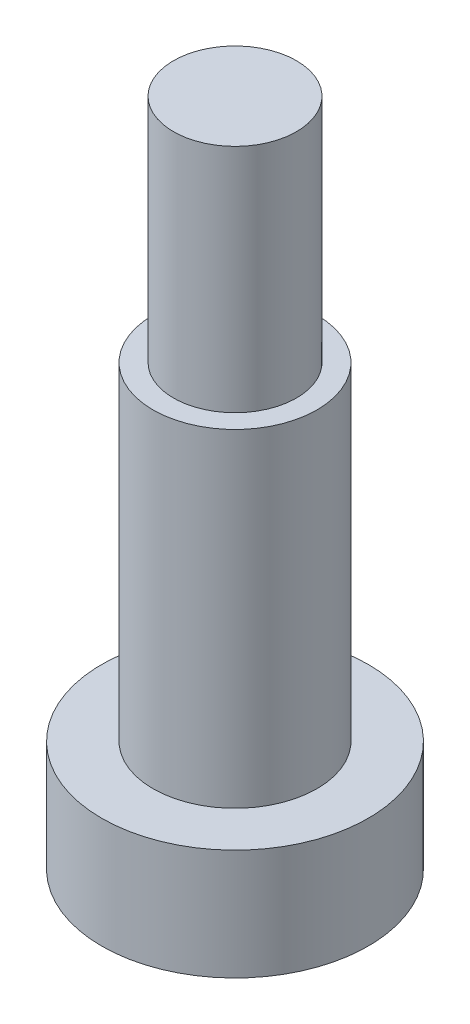
ISO-10303-21;
HEADER;
FILE_DESCRIPTION(('STEP AP214'),'2;1');
FILE_NAME('part.step','',(''),(''),'','','');
FILE_SCHEMA(('AUTOMOTIVE_DESIGN { 1 0 10303 214 1 1 1 1 }'));
ENDSEC;
DATA;
#1=APPLICATION_CONTEXT('core data for automotive mechanical design processes');
#2=APPLICATION_PROTOCOL_DEFINITION('international standard','automotive_design',2000,#1);
#3=PRODUCT_CONTEXT('',#1,'mechanical');
#4=PRODUCT('Part','Part','',(#3));
#5=PRODUCT_RELATED_PRODUCT_CATEGORY('part','',(#4));
#6=PRODUCT_DEFINITION_FORMATION('','',#4);
#7=PRODUCT_DEFINITION_CONTEXT('part definition',#1,'design');
#8=PRODUCT_DEFINITION('design','',#6,#7);
#9=PRODUCT_DEFINITION_SHAPE('','',#8);
#10=(LENGTH_UNIT() NAMED_UNIT(*) SI_UNIT(.MILLI.,.METRE.));
#11=(NAMED_UNIT(*) PLANE_ANGLE_UNIT() SI_UNIT($,.RADIAN.));
#12=(NAMED_UNIT(*) SI_UNIT($,.STERADIAN.) SOLID_ANGLE_UNIT());
#13=UNCERTAINTY_MEASURE_WITH_UNIT(LENGTH_MEASURE(1.E-05),#10,'distance_accuracy_value','');
#14=(GEOMETRIC_REPRESENTATION_CONTEXT(3) GLOBAL_UNCERTAINTY_ASSIGNED_CONTEXT((#13)) GLOBAL_UNIT_ASSIGNED_CONTEXT((#10,
#11,#12)) REPRESENTATION_CONTEXT('',''));
#15=CARTESIAN_POINT('',(0.,0.,0.));
#16=DIRECTION('',(0.,0.,1.));
#17=DIRECTION('',(1.,0.,0.));
#18=AXIS2_PLACEMENT_3D('',#15,#16,#17);
#19=CARTESIAN_POINT('',(0.,5.4,0.));
#20=DIRECTION('',(0.,-1.,0.));
#21=DIRECTION('',(0.,0.,-1.));
#22=AXIS2_PLACEMENT_3D('',#19,#20,#21);
#23=CYLINDRICAL_SURFACE('',#22,6.5);
#24=CARTESIAN_POINT('',(0.,5.4,0.));
#25=DIRECTION('',(0.,1.,0.));
#26=DIRECTION('',(0.,0.,1.));
#27=AXIS2_PLACEMENT_3D('',#24,#25,#26);
#28=CIRCLE('',#27,6.5);
#29=CARTESIAN_POINT('',(0.,5.4,-6.5));
#30=VERTEX_POINT('',#29);
#31=EDGE_CURVE('E44',#30,#30,#28,.T.);
#32=CARTESIAN_POINT('',(0.,0.,0.));
#33=DIRECTION('',(0.,1.,0.));
#34=DIRECTION('',(0.,0.,1.));
#35=AXIS2_PLACEMENT_3D('',#32,#33,#34);
#36=CIRCLE('',#35,6.5);
#37=CARTESIAN_POINT('',(0.,0.,-6.5));
#38=VERTEX_POINT('',#37);
#39=EDGE_CURVE('E35',#38,#38,#36,.T.);
#40=CARTESIAN_POINT('',(0.,5.4,-6.5));
#41=CARTESIAN_POINT('',(0.,5.34375,-6.5));
#42=CARTESIAN_POINT('',(0.,5.2875,-6.5));
#43=CARTESIAN_POINT('',(0.,5.175,-6.5));
#44=CARTESIAN_POINT('',(0.,5.11875,-6.5));
#45=CARTESIAN_POINT('',(0.,5.00625,-6.5));
#46=CARTESIAN_POINT('',(0.,4.95,-6.5));
#47=CARTESIAN_POINT('',(0.,4.8375,-6.5));
#48=CARTESIAN_POINT('',(0.,4.78125,-6.5));
#49=CARTESIAN_POINT('',(0.,4.66875,-6.5));
#50=CARTESIAN_POINT('',(0.,4.6125,-6.5));
#51=CARTESIAN_POINT('',(0.,4.5,-6.5));
#52=CARTESIAN_POINT('',(0.,4.44375,-6.5));
#53=CARTESIAN_POINT('',(0.,4.33125,-6.5));
#54=CARTESIAN_POINT('',(0.,4.275,-6.5));
#55=CARTESIAN_POINT('',(0.,4.1625,-6.5));
#56=CARTESIAN_POINT('',(0.,4.10625,-6.5));
#57=CARTESIAN_POINT('',(0.,3.99375,-6.5));
#58=CARTESIAN_POINT('',(0.,3.9375,-6.5));
#59=CARTESIAN_POINT('',(0.,3.825,-6.5));
#60=CARTESIAN_POINT('',(0.,3.76875,-6.5));
#61=CARTESIAN_POINT('',(0.,3.65625,-6.5));
#62=CARTESIAN_POINT('',(0.,3.6,-6.5));
#63=CARTESIAN_POINT('',(0.,3.4875,-6.5));
#64=CARTESIAN_POINT('',(0.,3.43125,-6.5));
#65=CARTESIAN_POINT('',(0.,3.31875,-6.5));
#66=CARTESIAN_POINT('',(0.,3.2625,-6.5));
#67=CARTESIAN_POINT('',(0.,3.15,-6.5));
#68=CARTESIAN_POINT('',(0.,3.09375,-6.5));
#69=CARTESIAN_POINT('',(0.,2.98125,-6.5));
#70=CARTESIAN_POINT('',(0.,2.925,-6.5));
#71=CARTESIAN_POINT('',(0.,2.8125,-6.5));
#72=CARTESIAN_POINT('',(0.,2.75625,-6.5));
#73=CARTESIAN_POINT('',(0.,2.64375,-6.5));
#74=CARTESIAN_POINT('',(0.,2.5875,-6.5));
#75=CARTESIAN_POINT('',(0.,2.475,-6.5));
#76=CARTESIAN_POINT('',(0.,2.41875,-6.5));
#77=CARTESIAN_POINT('',(0.,2.30625,-6.5));
#78=CARTESIAN_POINT('',(0.,2.25,-6.5));
#79=CARTESIAN_POINT('',(0.,2.1375,-6.5));
#80=CARTESIAN_POINT('',(0.,2.08125,-6.5));
#81=CARTESIAN_POINT('',(0.,1.96875,-6.5));
#82=CARTESIAN_POINT('',(0.,1.9125,-6.5));
#83=CARTESIAN_POINT('',(0.,1.8,-6.5));
#84=CARTESIAN_POINT('',(0.,1.74375,-6.5));
#85=CARTESIAN_POINT('',(0.,1.63125,-6.5));
#86=CARTESIAN_POINT('',(0.,1.575,-6.5));
#87=CARTESIAN_POINT('',(0.,1.4625,-6.5));
#88=CARTESIAN_POINT('',(0.,1.40625,-6.5));
#89=CARTESIAN_POINT('',(0.,1.29375,-6.5));
#90=CARTESIAN_POINT('',(0.,1.2375,-6.5));
#91=CARTESIAN_POINT('',(0.,1.125,-6.5));
#92=CARTESIAN_POINT('',(0.,1.06875,-6.5));
#93=CARTESIAN_POINT('',(0.,0.956249999999999,-6.5));
#94=CARTESIAN_POINT('',(0.,0.899999999999999,-6.5));
#95=CARTESIAN_POINT('',(0.,0.787499999999999,-6.5));
#96=CARTESIAN_POINT('',(0.,0.731249999999999,-6.5));
#97=CARTESIAN_POINT('',(0.,0.618749999999999,-6.5));
#98=CARTESIAN_POINT('',(0.,0.562499999999999,-6.5));
#99=CARTESIAN_POINT('',(0.,0.449999999999999,-6.5));
#100=CARTESIAN_POINT('',(0.,0.393749999999999,-6.5));
#101=CARTESIAN_POINT('',(0.,0.281249999999999,-6.5));
#102=CARTESIAN_POINT('',(0.,0.224999999999999,-6.5));
#103=CARTESIAN_POINT('',(0.,0.112499999999999,-6.5));
#104=CARTESIAN_POINT('',(0.,0.0562499999999989,-6.5));
#105=CARTESIAN_POINT('',(0.,0.,-6.5));
#106=B_SPLINE_CURVE_WITH_KNOTS('',3,(#40,#41,#42,#43,#44,#45,#46,#47,#48,#49,#50,#51,#52,#53,
#54,#55,#56,#57,#58,#59,#60,#61,#62,#63,#64,#65,#66,#67,#68,#69,#70,#71,#72,#73,#74,#75,#76,#77,
#78,#79,#80,#81,#82,#83,#84,#85,#86,#87,#88,#89,#90,#91,#92,#93,#94,#95,#96,#97,#98,#99,#100,
#101,#102,#103,#104,#105),.UNSPECIFIED.,.F.,.F.,(4,2,2,2,2,2,2,2,2,2,2,2,2,2,2,2,2,2,2,2,2,2,2,
2,2,2,2,2,2,2,2,2,4),(0.,0.16875,0.337499999999999,0.50625,0.674999999999999,0.84375,1.0125,
1.18125,1.35,1.51875,1.6875,1.85625,2.025,2.19375,2.3625,2.53125,2.7,2.86875,3.0375,3.20625,
3.375,3.54375,3.7125,3.88125,4.05,4.21875,4.3875,4.55625,4.725,4.89375,5.0625,5.23125,5.4),.UNSPECIFIED.);
#107=EDGE_CURVE('BSEAM32',#30,#38,#106,.T.);
#108=ORIENTED_EDGE('',*,*,#31,.F.);
#109=ORIENTED_EDGE('',*,*,#39,.T.);
#110=ORIENTED_EDGE('',*,*,#107,.T.);
#111=ORIENTED_EDGE('',*,*,#107,.F.);
#112=EDGE_LOOP('',(#108,#110,#109,#111));
#113=FACE_BOUND('',#112,.T.);
#114=ADVANCED_FACE('F32',(#113),#23,.T.);
#115=CARTESIAN_POINT('',(0.,5.4,0.));
#116=DIRECTION('',(0.,1.,0.));
#117=DIRECTION('',(0.,0.,1.));
#118=AXIS2_PLACEMENT_3D('',#115,#116,#117);
#119=PLANE('',#118);
#120=CARTESIAN_POINT('',(0.,5.4,0.));
#121=DIRECTION('',(0.,1.,0.));
#122=DIRECTION('',(0.,0.,1.));
#123=AXIS2_PLACEMENT_3D('',#120,#121,#122);
#124=CIRCLE('',#123,4.);
#125=CARTESIAN_POINT('',(0.,5.4,4.));
#126=VERTEX_POINT('',#125);
#127=EDGE_CURVE('E39',#126,#126,#124,.T.);
#128=ORIENTED_EDGE('',*,*,#127,.F.);
#129=EDGE_LOOP('',(#128));
#130=FACE_BOUND('',#129,.T.);
#131=ORIENTED_EDGE('',*,*,#31,.T.);
#132=EDGE_LOOP('',(#131));
#133=FACE_BOUND('',#132,.T.);
#134=ADVANCED_FACE('F61',(#130,#133),#119,.T.);
#135=CARTESIAN_POINT('',(0.,0.,0.));
#136=DIRECTION('',(0.,1.,0.));
#137=DIRECTION('',(0.,0.,1.));
#138=AXIS2_PLACEMENT_3D('',#135,#136,#137);
#139=PLANE('',#138);
#140=ORIENTED_EDGE('',*,*,#39,.F.);
#141=EDGE_LOOP('',(#140));
#142=FACE_BOUND('',#141,.T.);
#143=ADVANCED_FACE('F58',(#142),#139,.F.);
#144=CARTESIAN_POINT('',(0.,21.4,0.));
#145=DIRECTION('',(0.,-1.,0.));
#146=DIRECTION('',(0.,0.,-1.));
#147=AXIS2_PLACEMENT_3D('',#144,#145,#146);
#148=CYLINDRICAL_SURFACE('',#147,4.);
#149=CARTESIAN_POINT('',(0.,21.4,0.));
#150=DIRECTION('',(0.,1.,0.));
#151=DIRECTION('',(0.,0.,1.));
#152=AXIS2_PLACEMENT_3D('',#149,#150,#151);
#153=CIRCLE('',#152,4.);
#154=CARTESIAN_POINT('',(0.,21.4,4.));
#155=VERTEX_POINT('',#154);
#156=EDGE_CURVE('E49',#155,#155,#153,.T.);
#157=ORIENTED_EDGE('',*,*,#156,.F.);
#158=EDGE_LOOP('',(#157));
#159=FACE_BOUND('',#158,.T.);
#160=ORIENTED_EDGE('',*,*,#127,.T.);
#161=EDGE_LOOP('',(#160));
#162=FACE_BOUND('',#161,.T.);
#163=ADVANCED_FACE('F60',(#159,#162),#148,.T.);
#164=CARTESIAN_POINT('',(0.,21.4,0.));
#165=DIRECTION('',(0.,1.,0.));
#166=DIRECTION('',(0.,0.,1.));
#167=AXIS2_PLACEMENT_3D('',#164,#165,#166);
#168=PLANE('',#167);
#169=CARTESIAN_POINT('',(0.,21.4,0.));
#170=DIRECTION('',(0.,1.,0.));
#171=DIRECTION('',(0.,0.,1.));
#172=AXIS2_PLACEMENT_3D('',#169,#170,#171);
#173=CIRCLE('',#172,3.);
#174=CARTESIAN_POINT('',(0.,21.4,-3.));
#175=VERTEX_POINT('',#174);
#176=EDGE_CURVE('E10',#175,#175,#173,.T.);
#177=ORIENTED_EDGE('',*,*,#176,.F.);
#178=EDGE_LOOP('',(#177));
#179=FACE_BOUND('',#178,.T.);
#180=ORIENTED_EDGE('',*,*,#156,.T.);
#181=EDGE_LOOP('',(#180));
#182=FACE_BOUND('',#181,.T.);
#183=ADVANCED_FACE('F66',(#179,#182),#168,.T.);
#184=CARTESIAN_POINT('',(0.,32.65,0.));
#185=DIRECTION('',(0.,-1.,0.));
#186=DIRECTION('',(0.,0.,-1.));
#187=AXIS2_PLACEMENT_3D('',#184,#185,#186);
#188=CYLINDRICAL_SURFACE('',#187,3.);
#189=CARTESIAN_POINT('',(0.,32.65,0.));
#190=DIRECTION('',(0.,1.,0.));
#191=DIRECTION('',(0.,0.,1.));
#192=AXIS2_PLACEMENT_3D('',#189,#190,#191);
#193=CIRCLE('',#192,3.);
#194=CARTESIAN_POINT('',(0.,32.65,-3.));
#195=VERTEX_POINT('',#194);
#196=EDGE_CURVE('E48',#195,#195,#193,.T.);
#197=CARTESIAN_POINT('',(0.,32.65,-3.));
#198=CARTESIAN_POINT('',(0.,32.5328125,-3.));
#199=CARTESIAN_POINT('',(0.,32.415625,-3.));
#200=CARTESIAN_POINT('',(0.,32.18125,-3.));
#201=CARTESIAN_POINT('',(0.,32.0640625,-3.));
#202=CARTESIAN_POINT('',(0.,31.8296875,-3.));
#203=CARTESIAN_POINT('',(0.,31.7125,-3.));
#204=CARTESIAN_POINT('',(0.,31.478125,-3.));
#205=CARTESIAN_POINT('',(0.,31.3609375,-3.));
#206=CARTESIAN_POINT('',(0.,31.1265625,-3.));
#207=CARTESIAN_POINT('',(0.,31.009375,-3.));
#208=CARTESIAN_POINT('',(0.,30.775,-3.));
#209=CARTESIAN_POINT('',(0.,30.6578125,-3.));
#210=CARTESIAN_POINT('',(0.,30.4234375,-3.));
#211=CARTESIAN_POINT('',(0.,30.30625,-3.));
#212=CARTESIAN_POINT('',(0.,30.071875,-3.));
#213=CARTESIAN_POINT('',(0.,29.9546875,-3.));
#214=CARTESIAN_POINT('',(0.,29.7203125,-3.));
#215=CARTESIAN_POINT('',(0.,29.603125,-3.));
#216=CARTESIAN_POINT('',(0.,29.36875,-3.));
#217=CARTESIAN_POINT('',(0.,29.2515625,-3.));
#218=CARTESIAN_POINT('',(0.,29.0171875,-3.));
#219=CARTESIAN_POINT('',(0.,28.9,-3.));
#220=CARTESIAN_POINT('',(0.,28.665625,-3.));
#221=CARTESIAN_POINT('',(0.,28.5484375,-3.));
#222=CARTESIAN_POINT('',(0.,28.3140625,-3.));
#223=CARTESIAN_POINT('',(0.,28.196875,-3.));
#224=CARTESIAN_POINT('',(0.,27.9625,-3.));
#225=CARTESIAN_POINT('',(0.,27.8453125,-3.));
#226=CARTESIAN_POINT('',(0.,27.6109375,-3.));
#227=CARTESIAN_POINT('',(0.,27.49375,-3.));
#228=CARTESIAN_POINT('',(0.,27.259375,-3.));
#229=CARTESIAN_POINT('',(0.,27.1421875,-3.));
#230=CARTESIAN_POINT('',(0.,26.9078125,-3.));
#231=CARTESIAN_POINT('',(0.,26.790625,-3.));
#232=CARTESIAN_POINT('',(0.,26.55625,-3.));
#233=CARTESIAN_POINT('',(0.,26.4390625,-3.));
#234=CARTESIAN_POINT('',(0.,26.2046875,-3.));
#235=CARTESIAN_POINT('',(0.,26.0875,-3.));
#236=CARTESIAN_POINT('',(0.,25.853125,-3.));
#237=CARTESIAN_POINT('',(0.,25.7359375,-3.));
#238=CARTESIAN_POINT('',(0.,25.5015625,-3.));
#239=CARTESIAN_POINT('',(0.,25.384375,-3.));
#240=CARTESIAN_POINT('',(0.,25.15,-3.));
#241=CARTESIAN_POINT('',(0.,25.0328125,-3.));
#242=CARTESIAN_POINT('',(0.,24.7984375,-3.));
#243=CARTESIAN_POINT('',(0.,24.68125,-3.));
#244=CARTESIAN_POINT('',(0.,24.446875,-3.));
#245=CARTESIAN_POINT('',(0.,24.3296875,-3.));
#246=CARTESIAN_POINT('',(0.,24.0953125,-3.));
#247=CARTESIAN_POINT('',(0.,23.978125,-3.));
#248=CARTESIAN_POINT('',(0.,23.74375,-3.));
#249=CARTESIAN_POINT('',(0.,23.6265625,-3.));
#250=CARTESIAN_POINT('',(0.,23.3921875,-3.));
#251=CARTESIAN_POINT('',(0.,23.275,-3.));
#252=CARTESIAN_POINT('',(0.,23.040625,-3.));
#253=CARTESIAN_POINT('',(0.,22.9234375,-3.));
#254=CARTESIAN_POINT('',(0.,22.6890625,-3.));
#255=CARTESIAN_POINT('',(0.,22.571875,-3.));
#256=CARTESIAN_POINT('',(0.,22.3375,-3.));
#257=CARTESIAN_POINT('',(0.,22.2203125,-3.));
#258=CARTESIAN_POINT('',(0.,21.9859375,-3.));
#259=CARTESIAN_POINT('',(0.,21.86875,-3.));
#260=CARTESIAN_POINT('',(0.,21.634375,-3.));
#261=CARTESIAN_POINT('',(0.,21.5171875,-3.));
#262=CARTESIAN_POINT('',(0.,21.4,-3.));
#263=B_SPLINE_CURVE_WITH_KNOTS('',3,(#197,#198,#199,#200,#201,#202,#203,#204,#205,#206,#207,
#208,#209,#210,#211,#212,#213,#214,#215,#216,#217,#218,#219,#220,#221,#222,#223,#224,#225,#226,
#227,#228,#229,#230,#231,#232,#233,#234,#235,#236,#237,#238,#239,#240,#241,#242,#243,#244,#245,
#246,#247,#248,#249,#250,#251,#252,#253,#254,#255,#256,#257,#258,#259,#260,#261,#262),
.UNSPECIFIED.,.F.,.F.,(4,2,2,2,2,2,2,2,2,2,2,2,2,2,2,2,2,2,2,2,2,2,2,2,2,2,2,2,2,2,2,2,4),(0.,
0.351562499999999,0.703124999999999,1.0546875,1.40624999999999,1.7578125,2.109375,2.4609375,
2.8125,3.1640625,3.51562499999999,3.86718749999999,4.21874999999999,4.57031249999999,
4.92187499999999,5.2734375,5.62499999999999,5.97656249999999,6.32812499999999,6.67968749999999,
7.03124999999999,7.38281249999999,7.73437499999999,8.08593749999999,8.43749999999999,
8.78906249999999,9.14062499999999,9.49218749999999,9.84374999999999,10.1953125,10.546875,
10.8984375,11.25),.UNSPECIFIED.);
#264=EDGE_CURVE('BSEAM96',#195,#175,#263,.T.);
#265=ORIENTED_EDGE('',*,*,#196,.F.);
#266=ORIENTED_EDGE('',*,*,#176,.T.);
#267=ORIENTED_EDGE('',*,*,#264,.T.);
#268=ORIENTED_EDGE('',*,*,#264,.F.);
#269=EDGE_LOOP('',(#265,#267,#266,#268));
#270=FACE_BOUND('',#269,.T.);
#271=ADVANCED_FACE('F96',(#270),#188,.T.);
#272=CARTESIAN_POINT('',(0.,32.65,0.));
#273=DIRECTION('',(0.,1.,0.));
#274=DIRECTION('',(0.,0.,1.));
#275=AXIS2_PLACEMENT_3D('',#272,#273,#274);
#276=PLANE('',#275);
#277=ORIENTED_EDGE('',*,*,#196,.T.);
#278=EDGE_LOOP('',(#277));
#279=FACE_BOUND('',#278,.T.);
#280=ADVANCED_FACE('F106',(#279),#276,.T.);
#281=CLOSED_SHELL('',(#114,#134,#143,#163,#183,#271,#280));
#282=MANIFOLD_SOLID_BREP('B2',#281);
#283=ADVANCED_BREP_SHAPE_REPRESENTATION('',(#18,#282),#14);
#284=SHAPE_DEFINITION_REPRESENTATION(#9,#283);
ENDSEC;
END-ISO-10303-21;
